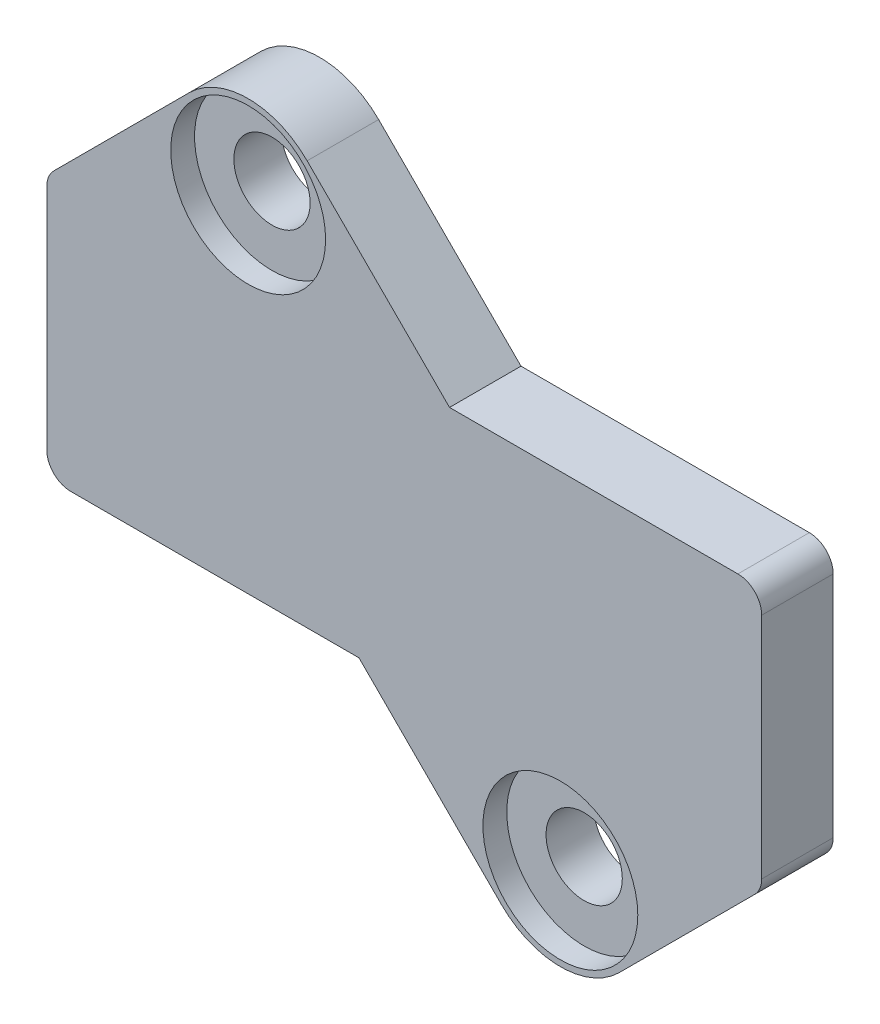
ISO-10303-21;
HEADER;
FILE_DESCRIPTION(('STEP AP214'),'2;1');
FILE_NAME('part.step','',(''),(''),'','','');
FILE_SCHEMA(('AUTOMOTIVE_DESIGN { 1 0 10303 214 1 1 1 1 }'));
ENDSEC;
DATA;
#1=APPLICATION_CONTEXT('core data for automotive mechanical design processes');
#2=APPLICATION_PROTOCOL_DEFINITION('international standard','automotive_design',2000,#1);
#3=PRODUCT_CONTEXT('',#1,'mechanical');
#4=PRODUCT('Part','Part','',(#3));
#5=PRODUCT_RELATED_PRODUCT_CATEGORY('part','',(#4));
#6=PRODUCT_DEFINITION_FORMATION('','',#4);
#7=PRODUCT_DEFINITION_CONTEXT('part definition',#1,'design');
#8=PRODUCT_DEFINITION('design','',#6,#7);
#9=PRODUCT_DEFINITION_SHAPE('','',#8);
#10=(LENGTH_UNIT() NAMED_UNIT(*) SI_UNIT(.MILLI.,.METRE.));
#11=(NAMED_UNIT(*) PLANE_ANGLE_UNIT() SI_UNIT($,.RADIAN.));
#12=(NAMED_UNIT(*) SI_UNIT($,.STERADIAN.) SOLID_ANGLE_UNIT());
#13=UNCERTAINTY_MEASURE_WITH_UNIT(LENGTH_MEASURE(1.E-05),#10,'distance_accuracy_value','');
#14=(GEOMETRIC_REPRESENTATION_CONTEXT(3) GLOBAL_UNCERTAINTY_ASSIGNED_CONTEXT((#13)) GLOBAL_UNIT_ASSIGNED_CONTEXT((#10,
#11,#12)) REPRESENTATION_CONTEXT('',''));
#15=CARTESIAN_POINT('',(0.,0.,0.));
#16=DIRECTION('',(0.,0.,1.));
#17=DIRECTION('',(1.,0.,0.));
#18=AXIS2_PLACEMENT_3D('',#15,#16,#17);
#19=CARTESIAN_POINT('',(15.,-5.50000000000003,3.));
#20=DIRECTION('',(-1.,0.,0.));
#21=DIRECTION('',(0.,-1.,0.));
#22=AXIS2_PLACEMENT_3D('',#19,#20,#21);
#23=PLANE('',#22);
#24=DIRECTION('',(0.,1.,0.));
#25=VECTOR('',#24,1.);
#26=CARTESIAN_POINT('',(15.,-5.50000000000003,0.));
#27=LINE('',#26,#25);
#28=CARTESIAN_POINT('',(15.,-5.08578643762693,0.));
#29=VERTEX_POINT('',#28);
#30=CARTESIAN_POINT('',(15.,4.49999999999997,0.));
#31=VERTEX_POINT('',#30);
#32=EDGE_CURVE('E192',#29,#31,#27,.T.);
#33=ORIENTED_EDGE('',*,*,#32,.T.);
#34=DIRECTION('',(0.,0.,-1.));
#35=VECTOR('',#34,1.);
#36=CARTESIAN_POINT('',(15.,4.49999999999997,3.));
#37=LINE('',#36,#35);
#38=CARTESIAN_POINT('',(15.,4.49999999999997,3.));
#39=VERTEX_POINT('',#38);
#40=EDGE_CURVE('E239',#31,#39,#37,.F.);
#41=ORIENTED_EDGE('',*,*,#40,.T.);
#42=DIRECTION('',(0.,1.,0.));
#43=VECTOR('',#42,1.);
#44=CARTESIAN_POINT('',(15.,-5.50000000000003,3.));
#45=LINE('',#44,#43);
#46=CARTESIAN_POINT('',(15.,-5.08578643762693,3.));
#47=VERTEX_POINT('',#46);
#48=EDGE_CURVE('E158',#47,#39,#45,.T.);
#49=ORIENTED_EDGE('',*,*,#48,.F.);
#50=DIRECTION('',(0.,0.,-1.));
#51=VECTOR('',#50,1.);
#52=CARTESIAN_POINT('',(15.,-5.08578643762693,3.));
#53=LINE('',#52,#51);
#54=EDGE_CURVE('E236',#47,#29,#53,.T.);
#55=ORIENTED_EDGE('',*,*,#54,.T.);
#56=EDGE_LOOP('',(#33,#41,#49,#55));
#57=FACE_BOUND('',#56,.T.);
#58=ADVANCED_FACE('F43',(#57),#23,.F.);
#59=CARTESIAN_POINT('',(15.,5.49999999999998,3.));
#60=DIRECTION('',(0.,-1.,0.));
#61=DIRECTION('',(1.,0.,0.));
#62=AXIS2_PLACEMENT_3D('',#59,#60,#61);
#63=PLANE('',#62);
#64=DIRECTION('',(-1.,0.,0.));
#65=VECTOR('',#64,1.);
#66=CARTESIAN_POINT('',(15.,5.49999999999998,3.));
#67=LINE('',#66,#65);
#68=CARTESIAN_POINT('',(14.,5.49999999999998,3.));
#69=VERTEX_POINT('',#68);
#70=CARTESIAN_POINT('',(1.89949493661169,5.49999999999998,3.));
#71=VERTEX_POINT('',#70);
#72=EDGE_CURVE('E146',#69,#71,#67,.T.);
#73=ORIENTED_EDGE('',*,*,#72,.F.);
#74=DIRECTION('',(0.,0.,-1.));
#75=VECTOR('',#74,1.);
#76=CARTESIAN_POINT('',(14.,5.49999999999998,3.));
#77=LINE('',#76,#75);
#78=CARTESIAN_POINT('',(14.,5.49999999999998,0.));
#79=VERTEX_POINT('',#78);
#80=EDGE_CURVE('E167',#69,#79,#77,.T.);
#81=ORIENTED_EDGE('',*,*,#80,.T.);
#82=DIRECTION('',(-1.,0.,0.));
#83=VECTOR('',#82,1.);
#84=CARTESIAN_POINT('',(15.,5.49999999999998,0.));
#85=LINE('',#84,#83);
#86=CARTESIAN_POINT('',(1.89949493661169,5.49999999999998,0.));
#87=VERTEX_POINT('',#86);
#88=EDGE_CURVE('E164',#79,#87,#85,.T.);
#89=ORIENTED_EDGE('',*,*,#88,.T.);
#90=DIRECTION('',(0.,0.,-1.));
#91=VECTOR('',#90,1.);
#92=CARTESIAN_POINT('',(1.89949493661169,5.49999999999998,3.));
#93=LINE('',#92,#91);
#94=EDGE_CURVE('E161',#71,#87,#93,.T.);
#95=ORIENTED_EDGE('',*,*,#94,.F.);
#96=EDGE_LOOP('',(#73,#81,#89,#95));
#97=FACE_BOUND('',#96,.T.);
#98=ADVANCED_FACE('F162',(#97),#63,.F.);
#99=CARTESIAN_POINT('',(1.89949493661169,5.49999999999998,3.));
#100=DIRECTION('',(-0.707106781186549,-0.707106781186546,0.));
#101=DIRECTION('',(0.707106781186546,-0.707106781186549,0.));
#102=AXIS2_PLACEMENT_3D('',#99,#100,#101);
#103=PLANE('',#102);
#104=DIRECTION('',(-0.707106781186546,0.707106781186549,0.));
#105=VECTOR('',#104,1.);
#106=CARTESIAN_POINT('',(1.89949493661169,5.49999999999998,0.));
#107=LINE('',#106,#105);
#108=CARTESIAN_POINT('',(-4.0753787975412,11.4748737341529,0.));
#109=VERTEX_POINT('',#108);
#110=EDGE_CURVE('E197',#87,#109,#107,.T.);
#111=ORIENTED_EDGE('',*,*,#110,.T.);
#112=DIRECTION('',(0.,0.,-1.));
#113=VECTOR('',#112,1.);
#114=CARTESIAN_POINT('',(-4.0753787975412,11.4748737341529,3.));
#115=LINE('',#114,#113);
#116=CARTESIAN_POINT('',(-4.0753787975412,11.4748737341529,3.));
#117=VERTEX_POINT('',#116);
#118=EDGE_CURVE('E168',#117,#109,#115,.T.);
#119=ORIENTED_EDGE('',*,*,#118,.F.);
#120=DIRECTION('',(-0.707106781186546,0.707106781186549,0.));
#121=VECTOR('',#120,1.);
#122=CARTESIAN_POINT('',(1.89949493661169,5.49999999999998,3.));
#123=LINE('',#122,#121);
#124=EDGE_CURVE('E151',#71,#117,#123,.T.);
#125=ORIENTED_EDGE('',*,*,#124,.F.);
#126=ORIENTED_EDGE('',*,*,#94,.T.);
#127=EDGE_LOOP('',(#111,#119,#125,#126));
#128=FACE_BOUND('',#127,.T.);
#129=ADVANCED_FACE('F170',(#128),#103,.F.);
#130=CARTESIAN_POINT('',(-6.55025253169412,8.99999999999998,3.));
#131=DIRECTION('',(0.,0.,-1.));
#132=DIRECTION('',(-1.,0.,0.));
#133=AXIS2_PLACEMENT_3D('',#130,#131,#132);
#134=CYLINDRICAL_SURFACE('',#133,3.5);
#135=CARTESIAN_POINT('',(-6.55025253169412,8.99999999999998,0.));
#136=DIRECTION('',(0.,0.,1.));
#137=DIRECTION('',(1.,0.,0.));
#138=AXIS2_PLACEMENT_3D('',#135,#136,#137);
#139=CIRCLE('',#138,3.5);
#140=CARTESIAN_POINT('',(-9.02512626584702,11.4748737341529,0.));
#141=VERTEX_POINT('',#140);
#142=EDGE_CURVE('E199',#109,#141,#139,.T.);
#143=ORIENTED_EDGE('',*,*,#142,.T.);
#144=DIRECTION('',(0.,0.,-1.));
#145=VECTOR('',#144,1.);
#146=CARTESIAN_POINT('',(-9.02512626584702,11.4748737341529,3.));
#147=LINE('',#146,#145);
#148=CARTESIAN_POINT('',(-9.02512626584702,11.4748737341529,3.));
#149=VERTEX_POINT('',#148);
#150=EDGE_CURVE('E223',#149,#141,#147,.T.);
#151=ORIENTED_EDGE('',*,*,#150,.F.);
#152=CARTESIAN_POINT('',(-6.55025253169412,8.99999999999998,3.));
#153=DIRECTION('',(0.,0.,1.));
#154=DIRECTION('',(1.,0.,0.));
#155=AXIS2_PLACEMENT_3D('',#152,#153,#154);
#156=CIRCLE('',#155,3.5);
#157=EDGE_CURVE('E173',#117,#149,#156,.T.);
#158=ORIENTED_EDGE('',*,*,#157,.F.);
#159=ORIENTED_EDGE('',*,*,#118,.T.);
#160=EDGE_LOOP('',(#143,#151,#158,#159));
#161=FACE_BOUND('',#160,.T.);
#162=ADVANCED_FACE('F291',(#161),#134,.T.);
#163=CARTESIAN_POINT('',(-15.,5.5,3.));
#164=DIRECTION('',(0.707106781186543,-0.707106781186552,0.));
#165=DIRECTION('',(0.707106781186552,0.707106781186543,0.));
#166=AXIS2_PLACEMENT_3D('',#163,#164,#165);
#167=PLANE('',#166);
#168=DIRECTION('',(-0.707106781186552,-0.707106781186543,0.));
#169=VECTOR('',#168,1.);
#170=CARTESIAN_POINT('',(-15.,5.5,0.));
#171=LINE('',#170,#169);
#172=CARTESIAN_POINT('',(-14.7071067811865,5.79289321881345,0.));
#173=VERTEX_POINT('',#172);
#174=EDGE_CURVE('E201',#141,#173,#171,.T.);
#175=ORIENTED_EDGE('',*,*,#174,.T.);
#176=DIRECTION('',(0.,0.,-1.));
#177=VECTOR('',#176,1.);
#178=CARTESIAN_POINT('',(-14.7071067811865,5.79289321881345,3.));
#179=LINE('',#178,#177);
#180=CARTESIAN_POINT('',(-14.7071067811865,5.79289321881345,3.));
#181=VERTEX_POINT('',#180);
#182=EDGE_CURVE('E11',#173,#181,#179,.F.);
#183=ORIENTED_EDGE('',*,*,#182,.T.);
#184=DIRECTION('',(-0.707106781186552,-0.707106781186543,0.));
#185=VECTOR('',#184,1.);
#186=CARTESIAN_POINT('',(-15.,5.5,3.));
#187=LINE('',#186,#185);
#188=EDGE_CURVE('E175',#149,#181,#187,.T.);
#189=ORIENTED_EDGE('',*,*,#188,.F.);
#190=ORIENTED_EDGE('',*,*,#150,.T.);
#191=EDGE_LOOP('',(#175,#183,#189,#190));
#192=FACE_BOUND('',#191,.T.);
#193=ADVANCED_FACE('F384',(#192),#167,.F.);
#194=CARTESIAN_POINT('',(-15.,5.5,3.));
#195=DIRECTION('',(1.,0.,0.));
#196=DIRECTION('',(0.,1.,0.));
#197=AXIS2_PLACEMENT_3D('',#194,#195,#196);
#198=PLANE('',#197);
#199=DIRECTION('',(0.,-1.,0.));
#200=VECTOR('',#199,1.);
#201=CARTESIAN_POINT('',(-15.,5.5,0.));
#202=LINE('',#201,#200);
#203=CARTESIAN_POINT('',(-15.,5.08578643762691,0.));
#204=VERTEX_POINT('',#203);
#205=CARTESIAN_POINT('',(-15.0000000000001,-4.50000000000001,0.));
#206=VERTEX_POINT('',#205);
#207=EDGE_CURVE('E204',#204,#206,#202,.T.);
#208=ORIENTED_EDGE('',*,*,#207,.T.);
#209=DIRECTION('',(0.,0.,-1.));
#210=VECTOR('',#209,1.);
#211=CARTESIAN_POINT('',(-15.0000000000001,-4.50000000000001,3.));
#212=LINE('',#211,#210);
#213=CARTESIAN_POINT('',(-15.0000000000001,-4.50000000000001,3.));
#214=VERTEX_POINT('',#213);
#215=EDGE_CURVE('E52',#206,#214,#212,.F.);
#216=ORIENTED_EDGE('',*,*,#215,.T.);
#217=DIRECTION('',(0.,-1.,0.));
#218=VECTOR('',#217,1.);
#219=CARTESIAN_POINT('',(-15.,5.5,3.));
#220=LINE('',#219,#218);
#221=CARTESIAN_POINT('',(-15.,5.08578643762691,3.));
#222=VERTEX_POINT('',#221);
#223=EDGE_CURVE('E181',#222,#214,#220,.T.);
#224=ORIENTED_EDGE('',*,*,#223,.F.);
#225=DIRECTION('',(0.,0.,-1.));
#226=VECTOR('',#225,1.);
#227=CARTESIAN_POINT('',(-15.,5.08578643762691,3.));
#228=LINE('',#227,#226);
#229=EDGE_CURVE('E251',#222,#204,#228,.T.);
#230=ORIENTED_EDGE('',*,*,#229,.T.);
#231=EDGE_LOOP('',(#208,#216,#224,#230));
#232=FACE_BOUND('',#231,.T.);
#233=ADVANCED_FACE('F302',(#232),#198,.F.);
#234=CARTESIAN_POINT('',(-15.0000000000001,-5.50000000000002,3.));
#235=DIRECTION('',(0.,1.,0.));
#236=DIRECTION('',(-1.,0.,0.));
#237=AXIS2_PLACEMENT_3D('',#234,#235,#236);
#238=PLANE('',#237);
#239=DIRECTION('',(1.,0.,0.));
#240=VECTOR('',#239,1.);
#241=CARTESIAN_POINT('',(-15.0000000000001,-5.50000000000002,3.));
#242=LINE('',#241,#240);
#243=CARTESIAN_POINT('',(-14.0000000000001,-5.50000000000002,3.));
#244=VERTEX_POINT('',#243);
#245=CARTESIAN_POINT('',(-1.89949493661172,-5.50000000000002,3.));
#246=VERTEX_POINT('',#245);
#247=EDGE_CURVE('E183',#244,#246,#242,.T.);
#248=ORIENTED_EDGE('',*,*,#247,.F.);
#249=DIRECTION('',(0.,0.,-1.));
#250=VECTOR('',#249,1.);
#251=CARTESIAN_POINT('',(-14.0000000000001,-5.50000000000002,3.));
#252=LINE('',#251,#250);
#253=CARTESIAN_POINT('',(-14.0000000000001,-5.50000000000002,0.));
#254=VERTEX_POINT('',#253);
#255=EDGE_CURVE('E248',#244,#254,#252,.T.);
#256=ORIENTED_EDGE('',*,*,#255,.T.);
#257=DIRECTION('',(1.,0.,0.));
#258=VECTOR('',#257,1.);
#259=CARTESIAN_POINT('',(-15.0000000000001,-5.50000000000002,0.));
#260=LINE('',#259,#258);
#261=CARTESIAN_POINT('',(-1.89949493661172,-5.50000000000002,0.));
#262=VERTEX_POINT('',#261);
#263=EDGE_CURVE('E207',#254,#262,#260,.T.);
#264=ORIENTED_EDGE('',*,*,#263,.T.);
#265=DIRECTION('',(0.,0.,-1.));
#266=VECTOR('',#265,1.);
#267=CARTESIAN_POINT('',(-1.89949493661172,-5.50000000000002,3.));
#268=LINE('',#267,#266);
#269=EDGE_CURVE('E220',#246,#262,#268,.T.);
#270=ORIENTED_EDGE('',*,*,#269,.F.);
#271=EDGE_LOOP('',(#248,#256,#264,#270));
#272=FACE_BOUND('',#271,.T.);
#273=ADVANCED_FACE('F310',(#272),#238,.F.);
#274=CARTESIAN_POINT('',(-1.89949493661172,-5.50000000000002,3.));
#275=DIRECTION('',(0.707106781186549,0.707106781186546,0.));
#276=DIRECTION('',(-0.707106781186546,0.707106781186549,0.));
#277=AXIS2_PLACEMENT_3D('',#274,#275,#276);
#278=PLANE('',#277);
#279=DIRECTION('',(0.707106781186546,-0.707106781186549,0.));
#280=VECTOR('',#279,1.);
#281=CARTESIAN_POINT('',(-1.89949493661172,-5.50000000000002,0.));
#282=LINE('',#281,#280);
#283=CARTESIAN_POINT('',(4.07537879754117,-11.4748737341529,0.));
#284=VERTEX_POINT('',#283);
#285=EDGE_CURVE('E209',#262,#284,#282,.T.);
#286=ORIENTED_EDGE('',*,*,#285,.T.);
#287=DIRECTION('',(0.,0.,-1.));
#288=VECTOR('',#287,1.);
#289=CARTESIAN_POINT('',(4.07537879754117,-11.4748737341529,3.));
#290=LINE('',#289,#288);
#291=CARTESIAN_POINT('',(4.07537879754117,-11.4748737341529,3.));
#292=VERTEX_POINT('',#291);
#293=EDGE_CURVE('E217',#292,#284,#290,.T.);
#294=ORIENTED_EDGE('',*,*,#293,.F.);
#295=DIRECTION('',(0.707106781186546,-0.707106781186549,0.));
#296=VECTOR('',#295,1.);
#297=CARTESIAN_POINT('',(-1.89949493661172,-5.50000000000002,3.));
#298=LINE('',#297,#296);
#299=EDGE_CURVE('E185',#246,#292,#298,.T.);
#300=ORIENTED_EDGE('',*,*,#299,.F.);
#301=ORIENTED_EDGE('',*,*,#269,.T.);
#302=EDGE_LOOP('',(#286,#294,#300,#301));
#303=FACE_BOUND('',#302,.T.);
#304=ADVANCED_FACE('F317',(#303),#278,.F.);
#305=CARTESIAN_POINT('',(6.55025253169409,-9.00000000000001,3.));
#306=DIRECTION('',(0.,0.,-1.));
#307=DIRECTION('',(-1.,0.,0.));
#308=AXIS2_PLACEMENT_3D('',#305,#306,#307);
#309=CYLINDRICAL_SURFACE('',#308,3.5);
#310=CARTESIAN_POINT('',(6.55025253169409,-9.00000000000001,0.));
#311=DIRECTION('',(0.,0.,1.));
#312=DIRECTION('',(1.,0.,0.));
#313=AXIS2_PLACEMENT_3D('',#310,#311,#312);
#314=CIRCLE('',#313,3.5);
#315=CARTESIAN_POINT('',(9.025126265847,-11.4748737341529,0.));
#316=VERTEX_POINT('',#315);
#317=EDGE_CURVE('E211',#284,#316,#314,.T.);
#318=ORIENTED_EDGE('',*,*,#317,.T.);
#319=DIRECTION('',(0.,0.,-1.));
#320=VECTOR('',#319,1.);
#321=CARTESIAN_POINT('',(9.025126265847,-11.4748737341529,3.));
#322=LINE('',#321,#320);
#323=CARTESIAN_POINT('',(9.025126265847,-11.4748737341529,3.));
#324=VERTEX_POINT('',#323);
#325=EDGE_CURVE('E191',#324,#316,#322,.T.);
#326=ORIENTED_EDGE('',*,*,#325,.F.);
#327=CARTESIAN_POINT('',(6.55025253169409,-9.00000000000001,3.));
#328=DIRECTION('',(0.,0.,1.));
#329=DIRECTION('',(1.,0.,0.));
#330=AXIS2_PLACEMENT_3D('',#327,#328,#329);
#331=CIRCLE('',#330,3.5);
#332=EDGE_CURVE('E187',#292,#324,#331,.T.);
#333=ORIENTED_EDGE('',*,*,#332,.F.);
#334=ORIENTED_EDGE('',*,*,#293,.T.);
#335=EDGE_LOOP('',(#318,#326,#333,#334));
#336=FACE_BOUND('',#335,.T.);
#337=ADVANCED_FACE('F320',(#336),#309,.T.);
#338=CARTESIAN_POINT('',(15.,-5.50000000000003,3.));
#339=DIRECTION('',(-0.707106781186544,0.707106781186551,0.));
#340=DIRECTION('',(-0.707106781186551,-0.707106781186544,0.));
#341=AXIS2_PLACEMENT_3D('',#338,#339,#340);
#342=PLANE('',#341);
#343=DIRECTION('',(0.707106781186551,0.707106781186544,0.));
#344=VECTOR('',#343,1.);
#345=CARTESIAN_POINT('',(15.,-5.50000000000003,0.));
#346=LINE('',#345,#344);
#347=CARTESIAN_POINT('',(14.7071067811865,-5.79289321881348,0.));
#348=VERTEX_POINT('',#347);
#349=EDGE_CURVE('E213',#316,#348,#346,.T.);
#350=ORIENTED_EDGE('',*,*,#349,.T.);
#351=DIRECTION('',(0.,0.,-1.));
#352=VECTOR('',#351,1.);
#353=CARTESIAN_POINT('',(14.7071067811865,-5.79289321881348,3.));
#354=LINE('',#353,#352);
#355=CARTESIAN_POINT('',(14.7071067811865,-5.79289321881348,3.));
#356=VERTEX_POINT('',#355);
#357=EDGE_CURVE('E60',#348,#356,#354,.F.);
#358=ORIENTED_EDGE('',*,*,#357,.T.);
#359=DIRECTION('',(0.707106781186551,0.707106781186544,0.));
#360=VECTOR('',#359,1.);
#361=CARTESIAN_POINT('',(15.,-5.50000000000003,3.));
#362=LINE('',#361,#360);
#363=EDGE_CURVE('E189',#324,#356,#362,.T.);
#364=ORIENTED_EDGE('',*,*,#363,.F.);
#365=ORIENTED_EDGE('',*,*,#325,.T.);
#366=EDGE_LOOP('',(#350,#358,#364,#365));
#367=FACE_BOUND('',#366,.T.);
#368=ADVANCED_FACE('F322',(#367),#342,.F.);
#369=CARTESIAN_POINT('',(-6.55025253169412,8.99999999999998,3.));
#370=DIRECTION('',(0.,0.,1.));
#371=DIRECTION('',(1.,0.,0.));
#372=AXIS2_PLACEMENT_3D('',#369,#370,#371);
#373=PLANE('',#372);
#374=CARTESIAN_POINT('',(-6.55025253169412,8.99999999999998,3.));
#375=DIRECTION('',(0.,0.,1.));
#376=DIRECTION('',(1.,0.,0.));
#377=AXIS2_PLACEMENT_3D('',#374,#375,#376);
#378=CIRCLE('',#377,3.25);
#379=CARTESIAN_POINT('',(-3.30025253169412,8.99999999999998,3.));
#380=VERTEX_POINT('',#379);
#381=EDGE_CURVE('E271',#380,#380,#378,.T.);
#382=ORIENTED_EDGE('',*,*,#381,.F.);
#383=EDGE_LOOP('',(#382));
#384=FACE_BOUND('',#383,.T.);
#385=CARTESIAN_POINT('',(6.55025253169409,-9.00000000000001,3.));
#386=DIRECTION('',(0.,0.,1.));
#387=DIRECTION('',(1.,0.,0.));
#388=AXIS2_PLACEMENT_3D('',#385,#386,#387);
#389=CIRCLE('',#388,3.25);
#390=CARTESIAN_POINT('',(9.8002525316941,-9.00000000000001,3.));
#391=VERTEX_POINT('',#390);
#392=EDGE_CURVE('E274',#391,#391,#389,.T.);
#393=ORIENTED_EDGE('',*,*,#392,.F.);
#394=EDGE_LOOP('',(#393));
#395=FACE_BOUND('',#394,.T.);
#396=ORIENTED_EDGE('',*,*,#48,.T.);
#397=CARTESIAN_POINT('',(14.,4.49999999999998,3.));
#398=DIRECTION('',(0.,0.,1.));
#399=DIRECTION('',(1.,0.,0.));
#400=AXIS2_PLACEMENT_3D('',#397,#398,#399);
#401=CIRCLE('',#400,1.);
#402=EDGE_CURVE('E154',#39,#69,#401,.T.);
#403=ORIENTED_EDGE('',*,*,#402,.T.);
#404=ORIENTED_EDGE('',*,*,#72,.T.);
#405=ORIENTED_EDGE('',*,*,#124,.T.);
#406=ORIENTED_EDGE('',*,*,#157,.T.);
#407=ORIENTED_EDGE('',*,*,#188,.T.);
#408=CARTESIAN_POINT('',(-14.,5.0857864376269,3.));
#409=DIRECTION('',(0.,0.,1.));
#410=DIRECTION('',(1.,0.,0.));
#411=AXIS2_PLACEMENT_3D('',#408,#409,#410);
#412=CIRCLE('',#411,1.);
#413=EDGE_CURVE('E241',#181,#222,#412,.T.);
#414=ORIENTED_EDGE('',*,*,#413,.T.);
#415=ORIENTED_EDGE('',*,*,#223,.T.);
#416=CARTESIAN_POINT('',(-14.0000000000001,-4.50000000000002,3.));
#417=DIRECTION('',(0.,0.,1.));
#418=DIRECTION('',(1.,0.,0.));
#419=AXIS2_PLACEMENT_3D('',#416,#417,#418);
#420=CIRCLE('',#419,1.);
#421=EDGE_CURVE('E68',#214,#244,#420,.T.);
#422=ORIENTED_EDGE('',*,*,#421,.T.);
#423=ORIENTED_EDGE('',*,*,#247,.T.);
#424=ORIENTED_EDGE('',*,*,#299,.T.);
#425=ORIENTED_EDGE('',*,*,#332,.T.);
#426=ORIENTED_EDGE('',*,*,#363,.T.);
#427=CARTESIAN_POINT('',(14.,-5.08578643762693,3.));
#428=DIRECTION('',(0.,0.,1.));
#429=DIRECTION('',(1.,0.,0.));
#430=AXIS2_PLACEMENT_3D('',#427,#428,#429);
#431=CIRCLE('',#430,1.);
#432=EDGE_CURVE('E244',#356,#47,#431,.T.);
#433=ORIENTED_EDGE('',*,*,#432,.T.);
#434=EDGE_LOOP('',(#396,#403,#404,#405,#406,#407,#414,#415,#422,#423,#424,#425,#426,#433));
#435=FACE_BOUND('',#434,.T.);
#436=ADVANCED_FACE('F149',(#384,#395,#435),#373,.T.);
#437=CARTESIAN_POINT('',(-6.55025253169412,8.99999999999998,0.));
#438=DIRECTION('',(0.,0.,1.));
#439=DIRECTION('',(1.,0.,0.));
#440=AXIS2_PLACEMENT_3D('',#437,#438,#439);
#441=PLANE('',#440);
#442=CARTESIAN_POINT('',(-6.55025253169412,8.99999999999998,0.));
#443=DIRECTION('',(0.,0.,1.));
#444=DIRECTION('',(1.,0.,0.));
#445=AXIS2_PLACEMENT_3D('',#442,#443,#444);
#446=CIRCLE('',#445,1.6);
#447=CARTESIAN_POINT('',(-4.95025253169412,8.99999999999998,0.));
#448=VERTEX_POINT('',#447);
#449=EDGE_CURVE('E256',#448,#448,#446,.T.);
#450=ORIENTED_EDGE('',*,*,#449,.T.);
#451=EDGE_LOOP('',(#450));
#452=FACE_BOUND('',#451,.T.);
#453=CARTESIAN_POINT('',(6.55025253169409,-9.00000000000001,0.));
#454=DIRECTION('',(0.,0.,1.));
#455=DIRECTION('',(1.,0.,0.));
#456=AXIS2_PLACEMENT_3D('',#453,#454,#455);
#457=CIRCLE('',#456,1.6);
#458=CARTESIAN_POINT('',(8.15025253169409,-9.00000000000001,0.));
#459=VERTEX_POINT('',#458);
#460=EDGE_CURVE('E262',#459,#459,#457,.T.);
#461=ORIENTED_EDGE('',*,*,#460,.T.);
#462=EDGE_LOOP('',(#461));
#463=FACE_BOUND('',#462,.T.);
#464=ORIENTED_EDGE('',*,*,#88,.F.);
#465=CARTESIAN_POINT('',(14.,4.49999999999998,0.));
#466=DIRECTION('',(0.,0.,1.));
#467=DIRECTION('',(1.,0.,0.));
#468=AXIS2_PLACEMENT_3D('',#465,#466,#467);
#469=CIRCLE('',#468,1.);
#470=EDGE_CURVE('E234',#79,#31,#469,.F.);
#471=ORIENTED_EDGE('',*,*,#470,.T.);
#472=ORIENTED_EDGE('',*,*,#32,.F.);
#473=CARTESIAN_POINT('',(14.,-5.08578643762693,0.));
#474=DIRECTION('',(0.,0.,1.));
#475=DIRECTION('',(1.,0.,0.));
#476=AXIS2_PLACEMENT_3D('',#473,#474,#475);
#477=CIRCLE('',#476,1.);
#478=EDGE_CURVE('E232',#29,#348,#477,.F.);
#479=ORIENTED_EDGE('',*,*,#478,.T.);
#480=ORIENTED_EDGE('',*,*,#349,.F.);
#481=ORIENTED_EDGE('',*,*,#317,.F.);
#482=ORIENTED_EDGE('',*,*,#285,.F.);
#483=ORIENTED_EDGE('',*,*,#263,.F.);
#484=CARTESIAN_POINT('',(-14.0000000000001,-4.50000000000002,0.));
#485=DIRECTION('',(0.,0.,1.));
#486=DIRECTION('',(1.,0.,0.));
#487=AXIS2_PLACEMENT_3D('',#484,#485,#486);
#488=CIRCLE('',#487,1.);
#489=EDGE_CURVE('E230',#254,#206,#488,.F.);
#490=ORIENTED_EDGE('',*,*,#489,.T.);
#491=ORIENTED_EDGE('',*,*,#207,.F.);
#492=CARTESIAN_POINT('',(-14.,5.0857864376269,0.));
#493=DIRECTION('',(0.,0.,1.));
#494=DIRECTION('',(1.,0.,0.));
#495=AXIS2_PLACEMENT_3D('',#492,#493,#494);
#496=CIRCLE('',#495,1.);
#497=EDGE_CURVE('E228',#204,#173,#496,.F.);
#498=ORIENTED_EDGE('',*,*,#497,.T.);
#499=ORIENTED_EDGE('',*,*,#174,.F.);
#500=ORIENTED_EDGE('',*,*,#142,.F.);
#501=ORIENTED_EDGE('',*,*,#110,.F.);
#502=EDGE_LOOP('',(#464,#471,#472,#479,#480,#481,#482,#483,#490,#491,#498,#499,#500,#501));
#503=FACE_BOUND('',#502,.T.);
#504=ADVANCED_FACE('F286',(#452,#463,#503),#441,.F.);
#505=CARTESIAN_POINT('',(6.55025253169409,-9.00000000000001,2.));
#506=DIRECTION('',(0.,0.,1.));
#507=DIRECTION('',(1.,0.,0.));
#508=AXIS2_PLACEMENT_3D('',#505,#506,#507);
#509=CYLINDRICAL_SURFACE('',#508,3.25);
#510=CARTESIAN_POINT('',(6.55025253169409,-9.00000000000001,2.));
#511=DIRECTION('',(0.,0.,1.));
#512=DIRECTION('',(1.,0.,0.));
#513=AXIS2_PLACEMENT_3D('',#510,#511,#512);
#514=CIRCLE('',#513,3.25);
#515=CARTESIAN_POINT('',(9.8002525316941,-9.00000000000001,2.));
#516=VERTEX_POINT('',#515);
#517=EDGE_CURVE('E260',#516,#516,#514,.T.);
#518=ORIENTED_EDGE('',*,*,#517,.F.);
#519=EDGE_LOOP('',(#518));
#520=FACE_BOUND('',#519,.T.);
#521=ORIENTED_EDGE('',*,*,#392,.T.);
#522=EDGE_LOOP('',(#521));
#523=FACE_BOUND('',#522,.T.);
#524=ADVANCED_FACE('F363',(#520,#523),#509,.F.);
#525=CARTESIAN_POINT('',(6.55025253169409,-9.00000000000001,2.));
#526=DIRECTION('',(0.,0.,1.));
#527=DIRECTION('',(1.,0.,0.));
#528=AXIS2_PLACEMENT_3D('',#525,#526,#527);
#529=PLANE('',#528);
#530=CARTESIAN_POINT('',(6.55025253169409,-9.00000000000001,2.));
#531=DIRECTION('',(0.,0.,1.));
#532=DIRECTION('',(1.,0.,0.));
#533=AXIS2_PLACEMENT_3D('',#530,#531,#532);
#534=CIRCLE('',#533,1.6);
#535=CARTESIAN_POINT('',(8.15025253169409,-9.00000000000001,2.));
#536=VERTEX_POINT('',#535);
#537=EDGE_CURVE('E47',#536,#536,#534,.T.);
#538=ORIENTED_EDGE('',*,*,#537,.F.);
#539=EDGE_LOOP('',(#538));
#540=FACE_BOUND('',#539,.T.);
#541=ORIENTED_EDGE('',*,*,#517,.T.);
#542=EDGE_LOOP('',(#541));
#543=FACE_BOUND('',#542,.T.);
#544=ADVANCED_FACE('F361',(#540,#543),#529,.T.);
#545=CARTESIAN_POINT('',(-6.55025253169412,8.99999999999998,2.));
#546=DIRECTION('',(0.,0.,1.));
#547=DIRECTION('',(1.,0.,0.));
#548=AXIS2_PLACEMENT_3D('',#545,#546,#547);
#549=CYLINDRICAL_SURFACE('',#548,3.25);
#550=CARTESIAN_POINT('',(-6.55025253169412,8.99999999999998,2.));
#551=DIRECTION('',(0.,0.,1.));
#552=DIRECTION('',(1.,0.,0.));
#553=AXIS2_PLACEMENT_3D('',#550,#551,#552);
#554=CIRCLE('',#553,3.25);
#555=CARTESIAN_POINT('',(-3.30025253169412,8.99999999999998,2.));
#556=VERTEX_POINT('',#555);
#557=EDGE_CURVE('E195',#556,#556,#554,.T.);
#558=ORIENTED_EDGE('',*,*,#557,.F.);
#559=EDGE_LOOP('',(#558));
#560=FACE_BOUND('',#559,.T.);
#561=ORIENTED_EDGE('',*,*,#381,.T.);
#562=EDGE_LOOP('',(#561));
#563=FACE_BOUND('',#562,.T.);
#564=ADVANCED_FACE('F358',(#560,#563),#549,.F.);
#565=CARTESIAN_POINT('',(-6.55025253169412,8.99999999999998,2.));
#566=DIRECTION('',(0.,0.,1.));
#567=DIRECTION('',(1.,0.,0.));
#568=AXIS2_PLACEMENT_3D('',#565,#566,#567);
#569=PLANE('',#568);
#570=CARTESIAN_POINT('',(-6.55025253169412,8.99999999999998,2.));
#571=DIRECTION('',(0.,0.,1.));
#572=DIRECTION('',(1.,0.,0.));
#573=AXIS2_PLACEMENT_3D('',#570,#571,#572);
#574=CIRCLE('',#573,1.6);
#575=CARTESIAN_POINT('',(-4.95025253169412,8.99999999999998,2.));
#576=VERTEX_POINT('',#575);
#577=EDGE_CURVE('E254',#576,#576,#574,.T.);
#578=ORIENTED_EDGE('',*,*,#577,.F.);
#579=EDGE_LOOP('',(#578));
#580=FACE_BOUND('',#579,.T.);
#581=ORIENTED_EDGE('',*,*,#557,.T.);
#582=EDGE_LOOP('',(#581));
#583=FACE_BOUND('',#582,.T.);
#584=ADVANCED_FACE('F336',(#580,#583),#569,.T.);
#585=CARTESIAN_POINT('',(14.,4.49999999999998,3.));
#586=DIRECTION('',(0.,0.,-1.));
#587=DIRECTION('',(-1.,0.,0.));
#588=AXIS2_PLACEMENT_3D('',#585,#586,#587);
#589=CYLINDRICAL_SURFACE('',#588,1.);
#590=ORIENTED_EDGE('',*,*,#402,.F.);
#591=ORIENTED_EDGE('',*,*,#40,.F.);
#592=ORIENTED_EDGE('',*,*,#470,.F.);
#593=ORIENTED_EDGE('',*,*,#80,.F.);
#594=EDGE_LOOP('',(#590,#591,#592,#593));
#595=FACE_BOUND('',#594,.T.);
#596=ADVANCED_FACE('F284',(#595),#589,.T.);
#597=CARTESIAN_POINT('',(14.,-5.08578643762693,3.));
#598=DIRECTION('',(0.,0.,-1.));
#599=DIRECTION('',(-1.,0.,0.));
#600=AXIS2_PLACEMENT_3D('',#597,#598,#599);
#601=CYLINDRICAL_SURFACE('',#600,1.);
#602=ORIENTED_EDGE('',*,*,#432,.F.);
#603=ORIENTED_EDGE('',*,*,#357,.F.);
#604=ORIENTED_EDGE('',*,*,#478,.F.);
#605=ORIENTED_EDGE('',*,*,#54,.F.);
#606=EDGE_LOOP('',(#602,#603,#604,#605));
#607=FACE_BOUND('',#606,.T.);
#608=ADVANCED_FACE('F324',(#607),#601,.T.);
#609=CARTESIAN_POINT('',(-14.0000000000001,-4.50000000000002,3.));
#610=DIRECTION('',(0.,0.,-1.));
#611=DIRECTION('',(-1.,0.,0.));
#612=AXIS2_PLACEMENT_3D('',#609,#610,#611);
#613=CYLINDRICAL_SURFACE('',#612,1.);
#614=ORIENTED_EDGE('',*,*,#421,.F.);
#615=ORIENTED_EDGE('',*,*,#215,.F.);
#616=ORIENTED_EDGE('',*,*,#489,.F.);
#617=ORIENTED_EDGE('',*,*,#255,.F.);
#618=EDGE_LOOP('',(#614,#615,#616,#617));
#619=FACE_BOUND('',#618,.T.);
#620=ADVANCED_FACE('F308',(#619),#613,.T.);
#621=CARTESIAN_POINT('',(-14.,5.0857864376269,3.));
#622=DIRECTION('',(0.,0.,-1.));
#623=DIRECTION('',(-1.,0.,0.));
#624=AXIS2_PLACEMENT_3D('',#621,#622,#623);
#625=CYLINDRICAL_SURFACE('',#624,1.);
#626=ORIENTED_EDGE('',*,*,#413,.F.);
#627=ORIENTED_EDGE('',*,*,#182,.F.);
#628=ORIENTED_EDGE('',*,*,#497,.F.);
#629=ORIENTED_EDGE('',*,*,#229,.F.);
#630=EDGE_LOOP('',(#626,#627,#628,#629));
#631=FACE_BOUND('',#630,.T.);
#632=ADVANCED_FACE('F45',(#631),#625,.T.);
#633=CARTESIAN_POINT('',(-6.55025253169412,8.99999999999998,0.));
#634=DIRECTION('',(0.,0.,1.));
#635=DIRECTION('',(1.,0.,0.));
#636=AXIS2_PLACEMENT_3D('',#633,#634,#635);
#637=CYLINDRICAL_SURFACE('',#636,1.6);
#638=ORIENTED_EDGE('',*,*,#577,.T.);
#639=EDGE_LOOP('',(#638));
#640=FACE_BOUND('',#639,.T.);
#641=ORIENTED_EDGE('',*,*,#449,.F.);
#642=EDGE_LOOP('',(#641));
#643=FACE_BOUND('',#642,.T.);
#644=ADVANCED_FACE('F342',(#640,#643),#637,.F.);
#645=CARTESIAN_POINT('',(6.55025253169409,-9.00000000000001,0.));
#646=DIRECTION('',(0.,0.,1.));
#647=DIRECTION('',(1.,0.,0.));
#648=AXIS2_PLACEMENT_3D('',#645,#646,#647);
#649=CYLINDRICAL_SURFACE('',#648,1.6);
#650=ORIENTED_EDGE('',*,*,#537,.T.);
#651=EDGE_LOOP('',(#650));
#652=FACE_BOUND('',#651,.T.);
#653=ORIENTED_EDGE('',*,*,#460,.F.);
#654=EDGE_LOOP('',(#653));
#655=FACE_BOUND('',#654,.T.);
#656=ADVANCED_FACE('F347',(#652,#655),#649,.F.);
#657=CLOSED_SHELL('',(#58,#98,#129,#162,#193,#233,#273,#304,#337,#368,#436,#504,#524,#544,#564,
#584,#596,#608,#620,#632,#644,#656));
#658=MANIFOLD_SOLID_BREP('B2',#657);
#659=ADVANCED_BREP_SHAPE_REPRESENTATION('',(#18,#658),#14);
#660=SHAPE_DEFINITION_REPRESENTATION(#9,#659);
ENDSEC;
END-ISO-10303-21;
